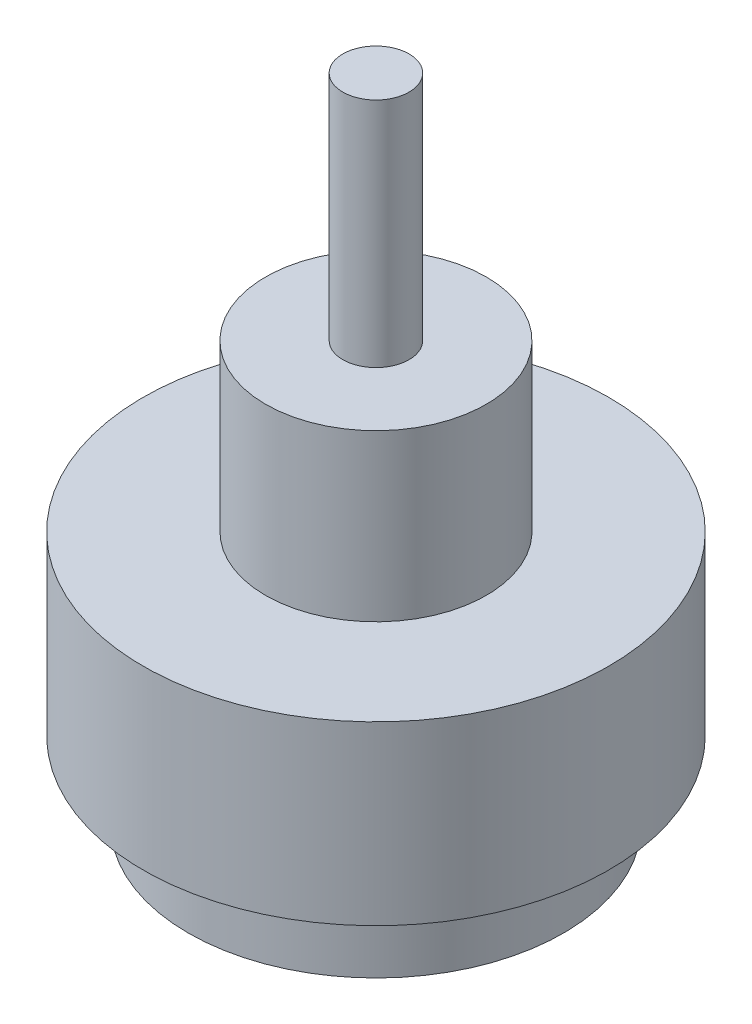
ISO-10303-21;
HEADER;
FILE_DESCRIPTION(('STEP AP214'),'2;1');
FILE_NAME('part.step','',(''),(''),'','','');
FILE_SCHEMA(('AUTOMOTIVE_DESIGN { 1 0 10303 214 1 1 1 1 }'));
ENDSEC;
DATA;
#1=APPLICATION_CONTEXT('core data for automotive mechanical design processes');
#2=APPLICATION_PROTOCOL_DEFINITION('international standard','automotive_design',2000,#1);
#3=PRODUCT_CONTEXT('',#1,'mechanical');
#4=PRODUCT('Part','Part','',(#3));
#5=PRODUCT_RELATED_PRODUCT_CATEGORY('part','',(#4));
#6=PRODUCT_DEFINITION_FORMATION('','',#4);
#7=PRODUCT_DEFINITION_CONTEXT('part definition',#1,'design');
#8=PRODUCT_DEFINITION('design','',#6,#7);
#9=PRODUCT_DEFINITION_SHAPE('','',#8);
#10=(LENGTH_UNIT() NAMED_UNIT(*) SI_UNIT(.MILLI.,.METRE.));
#11=(NAMED_UNIT(*) PLANE_ANGLE_UNIT() SI_UNIT($,.RADIAN.));
#12=(NAMED_UNIT(*) SI_UNIT($,.STERADIAN.) SOLID_ANGLE_UNIT());
#13=UNCERTAINTY_MEASURE_WITH_UNIT(LENGTH_MEASURE(1.E-05),#10,'distance_accuracy_value','');
#14=(GEOMETRIC_REPRESENTATION_CONTEXT(3) GLOBAL_UNCERTAINTY_ASSIGNED_CONTEXT((#13)) GLOBAL_UNIT_ASSIGNED_CONTEXT((#10,
#11,#12)) REPRESENTATION_CONTEXT('',''));
#15=CARTESIAN_POINT('',(0.,0.,0.));
#16=DIRECTION('',(0.,0.,1.));
#17=DIRECTION('',(1.,0.,0.));
#18=AXIS2_PLACEMENT_3D('',#15,#16,#17);
#19=CARTESIAN_POINT('',(-23.0459930518575,-14.,-11.8542930767102));
#20=DIRECTION('',(0.88925534465904,0.,0.457411119230099));
#21=DIRECTION('',(0.457411119230099,0.,-0.88925534465904));
#22=AXIS2_PLACEMENT_3D('',#19,#20,#21);
#23=PLANE('',#22);
#24=DIRECTION('',(0.457411119230099,0.,-0.88925534465904));
#25=VECTOR('',#24,1.);
#26=CARTESIAN_POINT('',(-23.0459930518575,-8.,-11.8542930767102));
#27=LINE('',#26,#25);
#28=CARTESIAN_POINT('',(-23.9120463361051,-8.,-10.1705943658592));
#29=VERTEX_POINT('',#28);
#30=CARTESIAN_POINT('',(-19.3379351438041,-8.,-19.0631478124496));
#31=VERTEX_POINT('',#30);
#32=EDGE_CURVE('E174',#29,#31,#27,.T.);
#33=ORIENTED_EDGE('',*,*,#32,.T.);
#34=DIRECTION('',(0.,1.,0.));
#35=VECTOR('',#34,1.);
#36=CARTESIAN_POINT('',(-19.3379351438041,-14.,-19.0631478124496));
#37=LINE('',#36,#35);
#38=CARTESIAN_POINT('',(-19.3379351438041,-14.,-19.0631478124496));
#39=VERTEX_POINT('',#38);
#40=EDGE_CURVE('E13',#39,#31,#37,.T.);
#41=ORIENTED_EDGE('',*,*,#40,.F.);
#42=DIRECTION('',(0.457411119230099,0.,-0.88925534465904));
#43=VECTOR('',#42,1.);
#44=CARTESIAN_POINT('',(-23.0459930518575,-14.,-11.8542930767102));
#45=LINE('',#44,#43);
#46=CARTESIAN_POINT('',(-23.9120463361051,-14.,-10.1705943658592));
#47=VERTEX_POINT('',#46);
#48=EDGE_CURVE('E153',#47,#39,#45,.T.);
#49=ORIENTED_EDGE('',*,*,#48,.F.);
#50=DIRECTION('',(0.,1.,0.));
#51=VECTOR('',#50,1.);
#52=CARTESIAN_POINT('',(-23.9120463361051,-14.,-10.1705943658592));
#53=LINE('',#52,#51);
#54=EDGE_CURVE('E172',#47,#29,#53,.T.);
#55=ORIENTED_EDGE('',*,*,#54,.T.);
#56=EDGE_LOOP('',(#33,#41,#49,#55));
#57=FACE_BOUND('',#56,.T.);
#58=ADVANCED_FACE('F115',(#57),#23,.F.);
#59=CARTESIAN_POINT('',(3.70805790805341,-14.,-7.20885473573924));
#60=DIRECTION('',(0.457411119230102,0.,-0.889255344659039));
#61=DIRECTION('',(-0.889255344659039,0.,-0.457411119230102));
#62=AXIS2_PLACEMENT_3D('',#59,#60,#61);
#63=PLANE('',#62);
#64=DIRECTION('',(-0.889255344659039,0.,-0.457411119230102));
#65=VECTOR('',#64,1.);
#66=CARTESIAN_POINT('',(3.70805790805341,-8.,-7.20885473573924));
#67=LINE('',#66,#65);
#68=CARTESIAN_POINT('',(-13.6151456474489,-8.,-16.1194853825658));
#69=VERTEX_POINT('',#68);
#70=EDGE_CURVE('E165',#69,#31,#67,.T.);
#71=ORIENTED_EDGE('',*,*,#70,.F.);
#72=DIRECTION('',(0.,1.,0.));
#73=VECTOR('',#72,1.);
#74=CARTESIAN_POINT('',(-13.6151456474489,-14.,-16.1194853825658));
#75=LINE('',#74,#73);
#76=CARTESIAN_POINT('',(-13.6151456474489,-14.,-16.1194853825658));
#77=VERTEX_POINT('',#76);
#78=EDGE_CURVE('E119',#77,#69,#75,.T.);
#79=ORIENTED_EDGE('',*,*,#78,.F.);
#80=DIRECTION('',(-0.889255344659039,0.,-0.457411119230102));
#81=VECTOR('',#80,1.);
#82=CARTESIAN_POINT('',(3.70805790805341,-14.,-7.20885473573924));
#83=LINE('',#82,#81);
#84=EDGE_CURVE('E162',#77,#39,#83,.T.);
#85=ORIENTED_EDGE('',*,*,#84,.T.);
#86=ORIENTED_EDGE('',*,*,#40,.T.);
#87=EDGE_LOOP('',(#71,#79,#85,#86));
#88=FACE_BOUND('',#87,.T.);
#89=ADVANCED_FACE('F163',(#88),#63,.T.);
#90=CARTESIAN_POINT('',(0.,-14.,0.));
#91=DIRECTION('',(0.,1.,0.));
#92=DIRECTION('',(0.,0.,1.));
#93=AXIS2_PLACEMENT_3D('',#90,#91,#92);
#94=CYLINDRICAL_SURFACE('',#93,21.1);
#95=CARTESIAN_POINT('',(0.,-8.,0.));
#96=DIRECTION('',(0.,1.,0.));
#97=DIRECTION('',(0.,0.,1.));
#98=AXIS2_PLACEMENT_3D('',#95,#96,#97);
#99=CIRCLE('',#98,21.1);
#100=CARTESIAN_POINT('',(-19.5536461382627,-8.,-7.92874029714717));
#101=VERTEX_POINT('',#100);
#102=EDGE_CURVE('E141',#69,#101,#99,.T.);
#103=ORIENTED_EDGE('',*,*,#102,.T.);
#104=DIRECTION('',(0.,1.,0.));
#105=VECTOR('',#104,1.);
#106=CARTESIAN_POINT('',(-19.5536461382627,-14.,-7.92874029714717));
#107=LINE('',#106,#105);
#108=CARTESIAN_POINT('',(-19.5536461382627,-14.,-7.92874029714717));
#109=VERTEX_POINT('',#108);
#110=EDGE_CURVE('E164',#109,#101,#107,.T.);
#111=ORIENTED_EDGE('',*,*,#110,.F.);
#112=CARTESIAN_POINT('',(0.,-14.,0.));
#113=DIRECTION('',(0.,1.,0.));
#114=DIRECTION('',(0.,0.,1.));
#115=AXIS2_PLACEMENT_3D('',#112,#113,#114);
#116=CIRCLE('',#115,21.1);
#117=EDGE_CURVE('E168',#77,#109,#116,.T.);
#118=ORIENTED_EDGE('',*,*,#117,.F.);
#119=ORIENTED_EDGE('',*,*,#78,.T.);
#120=EDGE_LOOP('',(#103,#111,#118,#119));
#121=FACE_BOUND('',#120,.T.);
#122=ADVANCED_FACE('F170',(#121),#94,.F.);
#123=CARTESIAN_POINT('',(-0.866053284247623,-14.,1.68369871085116));
#124=DIRECTION('',(0.457411119230104,0.,-0.889255344659037));
#125=DIRECTION('',(-0.889255344659037,0.,-0.457411119230104));
#126=AXIS2_PLACEMENT_3D('',#123,#124,#125);
#127=PLANE('',#126);
#128=DIRECTION('',(-0.889255344659037,0.,-0.457411119230104));
#129=VECTOR('',#128,1.);
#130=CARTESIAN_POINT('',(-0.866053284247623,-8.,1.68369871085116));
#131=LINE('',#130,#129);
#132=EDGE_CURVE('E146',#101,#29,#131,.T.);
#133=ORIENTED_EDGE('',*,*,#132,.T.);
#134=ORIENTED_EDGE('',*,*,#54,.F.);
#135=DIRECTION('',(-0.889255344659037,0.,-0.457411119230104));
#136=VECTOR('',#135,1.);
#137=CARTESIAN_POINT('',(-0.866053284247623,-14.,1.68369871085116));
#138=LINE('',#137,#136);
#139=EDGE_CURVE('E129',#109,#47,#138,.T.);
#140=ORIENTED_EDGE('',*,*,#139,.F.);
#141=ORIENTED_EDGE('',*,*,#110,.T.);
#142=EDGE_LOOP('',(#133,#134,#140,#141));
#143=FACE_BOUND('',#142,.T.);
#144=ADVANCED_FACE('F185',(#143),#127,.F.);
#145=CARTESIAN_POINT('',(0.,-14.,0.));
#146=DIRECTION('',(0.,1.,0.));
#147=DIRECTION('',(0.,0.,1.));
#148=AXIS2_PLACEMENT_3D('',#145,#146,#147);
#149=PLANE('',#148);
#150=ORIENTED_EDGE('',*,*,#48,.T.);
#151=ORIENTED_EDGE('',*,*,#84,.F.);
#152=ORIENTED_EDGE('',*,*,#117,.T.);
#153=ORIENTED_EDGE('',*,*,#139,.T.);
#154=EDGE_LOOP('',(#150,#151,#152,#153));
#155=FACE_BOUND('',#154,.T.);
#156=ADVANCED_FACE('F169',(#155),#149,.F.);
#157=CARTESIAN_POINT('',(0.,-8.,0.));
#158=DIRECTION('',(0.,1.,0.));
#159=DIRECTION('',(0.,0.,1.));
#160=AXIS2_PLACEMENT_3D('',#157,#158,#159);
#161=PLANE('',#160);
#162=ORIENTED_EDGE('',*,*,#32,.F.);
#163=ORIENTED_EDGE('',*,*,#132,.F.);
#164=ORIENTED_EDGE('',*,*,#102,.F.);
#165=ORIENTED_EDGE('',*,*,#70,.T.);
#166=EDGE_LOOP('',(#162,#163,#164,#165));
#167=FACE_BOUND('',#166,.T.);
#168=ADVANCED_FACE('F184',(#167),#161,.T.);
#169=CLOSED_SHELL('',(#58,#89,#122,#144,#156,#168));
#170=MANIFOLD_SOLID_BREP('B2',#169);
#171=CARTESIAN_POINT('',(-19.5536461382627,8.,-7.92874029714716));
#172=CARTESIAN_POINT('',(-16.8542982045805,8.,-14.2786457118331));
#173=CARTESIAN_POINT('',(-11.3167364195457,8.,-17.8084664362355));
#174=B_SPLINE_CURVE_WITH_KNOTS('',2,(#171,#172,#173),.UNSPECIFIED.,.F.,.F.,(3,3),(0.,1.),.UNSPECIFIED.);
#175=DIRECTION('',(0.,-1.,0.));
#176=VECTOR('',#175,1.);
#177=SURFACE_OF_LINEAR_EXTRUSION('',#174,#176);
#178=CARTESIAN_POINT('',(-19.5536461382627,-8.,-7.92874029714716));
#179=CARTESIAN_POINT('',(-16.8542982045805,-8.,-14.2786457118331));
#180=CARTESIAN_POINT('',(-11.3167364195457,-8.,-17.8084664362355));
#181=B_SPLINE_CURVE_WITH_KNOTS('',2,(#178,#179,#180),.UNSPECIFIED.,.F.,.F.,(3,3),(0.,1.),.UNSPECIFIED.);
#182=CARTESIAN_POINT('',(-19.5536461382627,-8.,-7.92874029714717));
#183=VERTEX_POINT('',#182);
#184=CARTESIAN_POINT('',(-13.6151456474489,-8.,-16.1194853825658));
#185=VERTEX_POINT('',#184);
#186=EDGE_CURVE('E307',#183,#185,#181,.T.);
#187=ORIENTED_EDGE('',*,*,#186,.F.);
#188=DIRECTION('',(0.,-1.,0.));
#189=VECTOR('',#188,1.);
#190=CARTESIAN_POINT('',(-19.5536461382627,8.,-7.92874029714717));
#191=LINE('',#190,#189);
#192=CARTESIAN_POINT('',(-19.5536461382627,8.,-7.92874029714717));
#193=VERTEX_POINT('',#192);
#194=EDGE_CURVE('E239',#193,#183,#191,.T.);
#195=ORIENTED_EDGE('',*,*,#194,.F.);
#196=CARTESIAN_POINT('',(-11.3167364195457,8.,-17.8084664362355));
#197=VERTEX_POINT('',#196);
#198=EDGE_CURVE('E374',#193,#197,#174,.T.);
#199=ORIENTED_EDGE('',*,*,#198,.T.);
#200=DIRECTION('',(0.,-1.,0.));
#201=VECTOR('',#200,1.);
#202=CARTESIAN_POINT('',(-11.3167364195457,8.,-17.8084664362355));
#203=LINE('',#202,#201);
#204=CARTESIAN_POINT('',(-11.3167364195457,-8.,-17.8084664362355));
#205=VERTEX_POINT('',#204);
#206=EDGE_CURVE('E387',#197,#205,#203,.T.);
#207=ORIENTED_EDGE('',*,*,#206,.T.);
#208=EDGE_CURVE('E271',#185,#205,#181,.T.);
#209=ORIENTED_EDGE('',*,*,#208,.F.);
#210=EDGE_LOOP('',(#187,#195,#199,#207,#209));
#211=FACE_BOUND('',#210,.T.);
#212=ADVANCED_FACE('F236',(#211),#177,.T.);
#213=CARTESIAN_POINT('',(0.,8.,0.));
#214=DIRECTION('',(0.,-1.,0.));
#215=DIRECTION('',(0.,0.,-1.));
#216=AXIS2_PLACEMENT_3D('',#213,#214,#215);
#217=CYLINDRICAL_SURFACE('',#216,21.1);
#218=CARTESIAN_POINT('',(0.,-8.,0.));
#219=DIRECTION('',(0.,1.,0.));
#220=DIRECTION('',(0.,0.,1.));
#221=AXIS2_PLACEMENT_3D('',#218,#219,#220);
#222=CIRCLE('',#221,21.1);
#223=EDGE_CURVE('E382',#183,#205,#222,.T.);
#224=ORIENTED_EDGE('',*,*,#223,.T.);
#225=ORIENTED_EDGE('',*,*,#206,.F.);
#226=CARTESIAN_POINT('',(0.,8.,0.));
#227=DIRECTION('',(0.,1.,0.));
#228=DIRECTION('',(0.,0.,1.));
#229=AXIS2_PLACEMENT_3D('',#226,#227,#228);
#230=CIRCLE('',#229,21.1);
#231=EDGE_CURVE('E261',#193,#197,#230,.T.);
#232=ORIENTED_EDGE('',*,*,#231,.F.);
#233=ORIENTED_EDGE('',*,*,#194,.T.);
#234=EDGE_LOOP('',(#224,#225,#232,#233));
#235=FACE_BOUND('',#234,.T.);
#236=ADVANCED_FACE('F397',(#235),#217,.T.);
#237=CARTESIAN_POINT('',(0.,8.,0.));
#238=DIRECTION('',(0.,1.,0.));
#239=DIRECTION('',(0.,0.,1.));
#240=AXIS2_PLACEMENT_3D('',#237,#238,#239);
#241=PLANE('',#240);
#242=CARTESIAN_POINT('',(0.,8.,0.));
#243=DIRECTION('',(0.,1.,0.));
#244=DIRECTION('',(0.,0.,1.));
#245=AXIS2_PLACEMENT_3D('',#242,#243,#244);
#246=CIRCLE('',#245,10.);
#247=CARTESIAN_POINT('',(0.,8.,10.));
#248=VERTEX_POINT('',#247);
#249=EDGE_CURVE('E371',#248,#248,#246,.T.);
#250=ORIENTED_EDGE('',*,*,#249,.F.);
#251=EDGE_LOOP('',(#250));
#252=FACE_BOUND('',#251,.T.);
#253=ORIENTED_EDGE('',*,*,#198,.F.);
#254=ORIENTED_EDGE('',*,*,#231,.T.);
#255=EDGE_LOOP('',(#253,#254));
#256=FACE_BOUND('',#255,.T.);
#257=ADVANCED_FACE('F403',(#252,#256),#241,.T.);
#258=CARTESIAN_POINT('',(0.,-8.,0.));
#259=DIRECTION('',(0.,1.,0.));
#260=DIRECTION('',(0.,0.,1.));
#261=AXIS2_PLACEMENT_3D('',#258,#259,#260);
#262=PLANE('',#261);
#263=CARTESIAN_POINT('',(0.,-8.,0.));
#264=DIRECTION('',(0.,1.,0.));
#265=DIRECTION('',(0.,0.,1.));
#266=AXIS2_PLACEMENT_3D('',#263,#264,#265);
#267=CIRCLE('',#266,17.);
#268=CARTESIAN_POINT('',(-15.8893403181968,-8.,-6.04391133724885));
#269=VERTEX_POINT('',#268);
#270=CARTESIAN_POINT('',(-9.5797714125075,-8.,-14.0437879393027));
#271=VERTEX_POINT('',#270);
#272=EDGE_CURVE('E358',#269,#271,#267,.T.);
#273=ORIENTED_EDGE('',*,*,#272,.T.);
#274=DIRECTION('',(-0.889255344659039,0.,-0.457411119230102));
#275=VECTOR('',#274,1.);
#276=CARTESIAN_POINT('',(3.70805790805341,-8.,-7.20885473573924));
#277=LINE('',#276,#275);
#278=EDGE_CURVE('E326',#271,#185,#277,.T.);
#279=ORIENTED_EDGE('',*,*,#278,.T.);
#280=ORIENTED_EDGE('',*,*,#208,.T.);
#281=ORIENTED_EDGE('',*,*,#223,.F.);
#282=DIRECTION('',(-0.889255344659037,0.,-0.457411119230104));
#283=VECTOR('',#282,1.);
#284=CARTESIAN_POINT('',(-0.866053284247623,-8.,1.68369871085116));
#285=LINE('',#284,#283);
#286=EDGE_CURVE('E300',#269,#183,#285,.T.);
#287=ORIENTED_EDGE('',*,*,#286,.F.);
#288=EDGE_LOOP('',(#273,#279,#280,#281,#287));
#289=FACE_BOUND('',#288,.T.);
#290=ADVANCED_FACE('F399',(#289),#262,.F.);
#291=CARTESIAN_POINT('',(0.,23.,0.));
#292=DIRECTION('',(0.,-1.,0.));
#293=DIRECTION('',(0.,0.,-1.));
#294=AXIS2_PLACEMENT_3D('',#291,#292,#293);
#295=CYLINDRICAL_SURFACE('',#294,10.);
#296=CARTESIAN_POINT('',(0.,23.,0.));
#297=DIRECTION('',(0.,1.,0.));
#298=DIRECTION('',(0.,0.,1.));
#299=AXIS2_PLACEMENT_3D('',#296,#297,#298);
#300=CIRCLE('',#299,10.);
#301=CARTESIAN_POINT('',(0.,23.,10.));
#302=VERTEX_POINT('',#301);
#303=EDGE_CURVE('E368',#302,#302,#300,.T.);
#304=ORIENTED_EDGE('',*,*,#303,.F.);
#305=EDGE_LOOP('',(#304));
#306=FACE_BOUND('',#305,.T.);
#307=ORIENTED_EDGE('',*,*,#249,.T.);
#308=EDGE_LOOP('',(#307));
#309=FACE_BOUND('',#308,.T.);
#310=ADVANCED_FACE('F412',(#306,#309),#295,.T.);
#311=CARTESIAN_POINT('',(0.,23.,0.));
#312=DIRECTION('',(0.,1.,0.));
#313=DIRECTION('',(0.,0.,1.));
#314=AXIS2_PLACEMENT_3D('',#311,#312,#313);
#315=PLANE('',#314);
#316=CARTESIAN_POINT('',(0.,23.,0.));
#317=DIRECTION('',(0.,1.,0.));
#318=DIRECTION('',(0.,0.,1.));
#319=AXIS2_PLACEMENT_3D('',#316,#317,#318);
#320=CIRCLE('',#319,3.);
#321=CARTESIAN_POINT('',(0.,23.,-3.));
#322=VERTEX_POINT('',#321);
#323=EDGE_CURVE('E360',#322,#322,#320,.T.);
#324=ORIENTED_EDGE('',*,*,#323,.F.);
#325=EDGE_LOOP('',(#324));
#326=FACE_BOUND('',#325,.T.);
#327=ORIENTED_EDGE('',*,*,#303,.T.);
#328=EDGE_LOOP('',(#327));
#329=FACE_BOUND('',#328,.T.);
#330=ADVANCED_FACE('F418',(#326,#329),#315,.T.);
#331=CARTESIAN_POINT('',(0.,44.,0.));
#332=DIRECTION('',(0.,-1.,0.));
#333=DIRECTION('',(0.,0.,-1.));
#334=AXIS2_PLACEMENT_3D('',#331,#332,#333);
#335=CYLINDRICAL_SURFACE('',#334,3.);
#336=CARTESIAN_POINT('',(0.,44.,0.));
#337=DIRECTION('',(0.,1.,0.));
#338=DIRECTION('',(0.,0.,1.));
#339=AXIS2_PLACEMENT_3D('',#336,#337,#338);
#340=CIRCLE('',#339,3.);
#341=CARTESIAN_POINT('',(0.,44.,-3.));
#342=VERTEX_POINT('',#341);
#343=EDGE_CURVE('E361',#342,#342,#340,.T.);
#344=CARTESIAN_POINT('',(0.,44.,-3.));
#345=CARTESIAN_POINT('',(0.,43.78125,-3.));
#346=CARTESIAN_POINT('',(0.,43.5625,-3.));
#347=CARTESIAN_POINT('',(0.,43.125,-3.));
#348=CARTESIAN_POINT('',(0.,42.90625,-3.));
#349=CARTESIAN_POINT('',(0.,42.46875,-3.));
#350=CARTESIAN_POINT('',(0.,42.25,-3.));
#351=CARTESIAN_POINT('',(0.,41.8125,-3.));
#352=CARTESIAN_POINT('',(0.,41.59375,-3.));
#353=CARTESIAN_POINT('',(0.,41.15625,-3.));
#354=CARTESIAN_POINT('',(0.,40.9375,-3.));
#355=CARTESIAN_POINT('',(0.,40.5,-3.));
#356=CARTESIAN_POINT('',(0.,40.28125,-3.));
#357=CARTESIAN_POINT('',(0.,39.84375,-3.));
#358=CARTESIAN_POINT('',(0.,39.625,-3.));
#359=CARTESIAN_POINT('',(0.,39.1875,-3.));
#360=CARTESIAN_POINT('',(0.,38.96875,-3.));
#361=CARTESIAN_POINT('',(0.,38.53125,-3.));
#362=CARTESIAN_POINT('',(0.,38.3125,-3.));
#363=CARTESIAN_POINT('',(0.,37.875,-3.));
#364=CARTESIAN_POINT('',(0.,37.65625,-3.));
#365=CARTESIAN_POINT('',(0.,37.21875,-3.));
#366=CARTESIAN_POINT('',(0.,37.,-3.));
#367=CARTESIAN_POINT('',(0.,36.5625,-3.));
#368=CARTESIAN_POINT('',(0.,36.34375,-3.));
#369=CARTESIAN_POINT('',(0.,35.90625,-3.));
#370=CARTESIAN_POINT('',(0.,35.6875,-3.));
#371=CARTESIAN_POINT('',(0.,35.25,-3.));
#372=CARTESIAN_POINT('',(0.,35.03125,-3.));
#373=CARTESIAN_POINT('',(0.,34.59375,-3.));
#374=CARTESIAN_POINT('',(0.,34.375,-3.));
#375=CARTESIAN_POINT('',(0.,33.9375,-3.));
#376=CARTESIAN_POINT('',(0.,33.71875,-3.));
#377=CARTESIAN_POINT('',(0.,33.28125,-3.));
#378=CARTESIAN_POINT('',(0.,33.0625,-3.));
#379=CARTESIAN_POINT('',(0.,32.625,-3.));
#380=CARTESIAN_POINT('',(0.,32.40625,-3.));
#381=CARTESIAN_POINT('',(0.,31.96875,-3.));
#382=CARTESIAN_POINT('',(0.,31.75,-3.));
#383=CARTESIAN_POINT('',(0.,31.3125,-3.));
#384=CARTESIAN_POINT('',(0.,31.09375,-3.));
#385=CARTESIAN_POINT('',(0.,30.65625,-3.));
#386=CARTESIAN_POINT('',(0.,30.4375,-3.));
#387=CARTESIAN_POINT('',(0.,30.,-3.));
#388=CARTESIAN_POINT('',(0.,29.78125,-3.));
#389=CARTESIAN_POINT('',(0.,29.34375,-3.));
#390=CARTESIAN_POINT('',(0.,29.125,-3.));
#391=CARTESIAN_POINT('',(0.,28.6875,-3.));
#392=CARTESIAN_POINT('',(0.,28.46875,-3.));
#393=CARTESIAN_POINT('',(0.,28.03125,-3.));
#394=CARTESIAN_POINT('',(0.,27.8125,-3.));
#395=CARTESIAN_POINT('',(0.,27.375,-3.));
#396=CARTESIAN_POINT('',(0.,27.15625,-3.));
#397=CARTESIAN_POINT('',(0.,26.71875,-3.));
#398=CARTESIAN_POINT('',(0.,26.5,-3.));
#399=CARTESIAN_POINT('',(0.,26.0625,-3.));
#400=CARTESIAN_POINT('',(0.,25.84375,-3.));
#401=CARTESIAN_POINT('',(0.,25.40625,-3.));
#402=CARTESIAN_POINT('',(0.,25.1875,-3.));
#403=CARTESIAN_POINT('',(0.,24.75,-3.));
#404=CARTESIAN_POINT('',(0.,24.53125,-3.));
#405=CARTESIAN_POINT('',(0.,24.09375,-3.));
#406=CARTESIAN_POINT('',(0.,23.875,-3.));
#407=CARTESIAN_POINT('',(0.,23.4375,-3.));
#408=CARTESIAN_POINT('',(0.,23.21875,-3.));
#409=CARTESIAN_POINT('',(0.,23.,-3.));
#410=B_SPLINE_CURVE_WITH_KNOTS('',3,(#344,#345,#346,#347,#348,#349,#350,#351,#352,#353,#354,
#355,#356,#357,#358,#359,#360,#361,#362,#363,#364,#365,#366,#367,#368,#369,#370,#371,#372,#373,
#374,#375,#376,#377,#378,#379,#380,#381,#382,#383,#384,#385,#386,#387,#388,#389,#390,#391,#392,
#393,#394,#395,#396,#397,#398,#399,#400,#401,#402,#403,#404,#405,#406,#407,#408,#409),
.UNSPECIFIED.,.F.,.F.,(4,2,2,2,2,2,2,2,2,2,2,2,2,2,2,2,2,2,2,2,2,2,2,2,2,2,2,2,2,2,2,2,4),(0.,
0.656250000000004,1.3125,1.96875000000001,2.625,3.28125000000001,3.9375,4.59375,5.25,5.90625,
6.56250000000001,7.21875,7.875,8.53125,9.1875,9.84375,10.5,11.15625,11.8125,12.46875,13.125,
13.78125,14.4375,15.09375,15.75,16.40625,17.0625,17.71875,18.375,19.03125,19.6875,20.34375,21.),.UNSPECIFIED.);
#411=EDGE_CURVE('BSEAM421',#342,#322,#410,.T.);
#412=ORIENTED_EDGE('',*,*,#343,.F.);
#413=ORIENTED_EDGE('',*,*,#323,.T.);
#414=ORIENTED_EDGE('',*,*,#411,.T.);
#415=ORIENTED_EDGE('',*,*,#411,.F.);
#416=EDGE_LOOP('',(#412,#414,#413,#415));
#417=FACE_BOUND('',#416,.T.);
#418=ADVANCED_FACE('F421',(#417),#335,.T.);
#419=CARTESIAN_POINT('',(0.,44.,0.));
#420=DIRECTION('',(0.,1.,0.));
#421=DIRECTION('',(0.,0.,1.));
#422=AXIS2_PLACEMENT_3D('',#419,#420,#421);
#423=PLANE('',#422);
#424=ORIENTED_EDGE('',*,*,#343,.T.);
#425=EDGE_LOOP('',(#424));
#426=FACE_BOUND('',#425,.T.);
#427=ADVANCED_FACE('F430',(#426),#423,.T.);
#428=CARTESIAN_POINT('',(0.,-15.,0.));
#429=DIRECTION('',(0.,1.,0.));
#430=DIRECTION('',(0.,0.,1.));
#431=AXIS2_PLACEMENT_3D('',#428,#429,#430);
#432=CYLINDRICAL_SURFACE('',#431,17.);
#433=DIRECTION('',(0.,1.,0.));
#434=VECTOR('',#433,1.);
#435=CARTESIAN_POINT('',(-9.5797714125075,-14.,-14.0437879393027));
#436=LINE('',#435,#434);
#437=CARTESIAN_POINT('',(-9.5797714125075,-14.,-14.0437879393027));
#438=VERTEX_POINT('',#437);
#439=EDGE_CURVE('E315',#438,#271,#436,.T.);
#440=ORIENTED_EDGE('',*,*,#439,.T.);
#441=ORIENTED_EDGE('',*,*,#272,.F.);
#442=DIRECTION('',(0.,1.,0.));
#443=VECTOR('',#442,1.);
#444=CARTESIAN_POINT('',(-15.8893403181968,-14.,-6.04391133724885));
#445=LINE('',#444,#443);
#446=CARTESIAN_POINT('',(-15.8893403181968,-14.,-6.04391133724885));
#447=VERTEX_POINT('',#446);
#448=EDGE_CURVE('E329',#447,#269,#445,.T.);
#449=ORIENTED_EDGE('',*,*,#448,.F.);
#450=CARTESIAN_POINT('',(0.,-14.,0.));
#451=DIRECTION('',(0.,1.,0.));
#452=DIRECTION('',(0.,0.,1.));
#453=AXIS2_PLACEMENT_3D('',#450,#451,#452);
#454=CIRCLE('',#453,17.);
#455=EDGE_CURVE('E320',#438,#447,#454,.T.);
#456=ORIENTED_EDGE('',*,*,#455,.F.);
#457=EDGE_LOOP('',(#440,#441,#449,#456));
#458=FACE_BOUND('',#457,.T.);
#459=CARTESIAN_POINT('',(0.,-15.,0.));
#460=DIRECTION('',(0.,1.,0.));
#461=DIRECTION('',(0.,0.,1.));
#462=AXIS2_PLACEMENT_3D('',#459,#460,#461);
#463=CIRCLE('',#462,17.);
#464=CARTESIAN_POINT('',(0.,-15.,17.));
#465=VERTEX_POINT('',#464);
#466=EDGE_CURVE('E359',#465,#465,#463,.T.);
#467=ORIENTED_EDGE('',*,*,#466,.T.);
#468=EDGE_LOOP('',(#467));
#469=FACE_BOUND('',#468,.T.);
#470=ADVANCED_FACE('F431',(#458,#469),#432,.T.);
#471=CARTESIAN_POINT('',(0.,-15.,0.));
#472=DIRECTION('',(0.,1.,0.));
#473=DIRECTION('',(0.,0.,1.));
#474=AXIS2_PLACEMENT_3D('',#471,#472,#473);
#475=PLANE('',#474);
#476=CARTESIAN_POINT('',(9.5,-15.,0.));
#477=DIRECTION('',(0.,1.,0.));
#478=DIRECTION('',(0.,0.,1.));
#479=AXIS2_PLACEMENT_3D('',#476,#477,#478);
#480=CIRCLE('',#479,1.5);
#481=CARTESIAN_POINT('',(9.5,-15.,1.5));
#482=VERTEX_POINT('',#481);
#483=EDGE_CURVE('E311',#482,#482,#480,.T.);
#484=ORIENTED_EDGE('',*,*,#483,.T.);
#485=EDGE_LOOP('',(#484));
#486=FACE_BOUND('',#485,.T.);
#487=CARTESIAN_POINT('',(-9.5,-15.,0.));
#488=DIRECTION('',(0.,1.,0.));
#489=DIRECTION('',(0.,0.,1.));
#490=AXIS2_PLACEMENT_3D('',#487,#488,#489);
#491=CIRCLE('',#490,1.5);
#492=CARTESIAN_POINT('',(-9.5,-15.,1.5));
#493=VERTEX_POINT('',#492);
#494=EDGE_CURVE('E333',#493,#493,#491,.T.);
#495=ORIENTED_EDGE('',*,*,#494,.T.);
#496=EDGE_LOOP('',(#495));
#497=FACE_BOUND('',#496,.T.);
#498=CARTESIAN_POINT('',(0.,-15.,12.5));
#499=DIRECTION('',(0.,1.,0.));
#500=DIRECTION('',(0.,0.,1.));
#501=AXIS2_PLACEMENT_3D('',#498,#499,#500);
#502=CIRCLE('',#501,1.5);
#503=CARTESIAN_POINT('',(0.,-15.,14.));
#504=VERTEX_POINT('',#503);
#505=EDGE_CURVE('E336',#504,#504,#502,.T.);
#506=ORIENTED_EDGE('',*,*,#505,.T.);
#507=EDGE_LOOP('',(#506));
#508=FACE_BOUND('',#507,.T.);
#509=CARTESIAN_POINT('',(0.,-15.,-12.5));
#510=DIRECTION('',(0.,1.,0.));
#511=DIRECTION('',(0.,0.,1.));
#512=AXIS2_PLACEMENT_3D('',#509,#510,#511);
#513=CIRCLE('',#512,1.5);
#514=CARTESIAN_POINT('',(0.,-15.,-11.));
#515=VERTEX_POINT('',#514);
#516=EDGE_CURVE('E341',#515,#515,#513,.T.);
#517=ORIENTED_EDGE('',*,*,#516,.T.);
#518=EDGE_LOOP('',(#517));
#519=FACE_BOUND('',#518,.T.);
#520=CARTESIAN_POINT('',(0.,-15.,0.));
#521=DIRECTION('',(0.,1.,0.));
#522=DIRECTION('',(0.,0.,1.));
#523=AXIS2_PLACEMENT_3D('',#520,#521,#522);
#524=CIRCLE('',#523,3.);
#525=CARTESIAN_POINT('',(0.,-15.,3.));
#526=VERTEX_POINT('',#525);
#527=EDGE_CURVE('E349',#526,#526,#524,.T.);
#528=ORIENTED_EDGE('',*,*,#527,.T.);
#529=EDGE_LOOP('',(#528));
#530=FACE_BOUND('',#529,.T.);
#531=ORIENTED_EDGE('',*,*,#466,.F.);
#532=EDGE_LOOP('',(#531));
#533=FACE_BOUND('',#532,.T.);
#534=ADVANCED_FACE('F434',(#486,#497,#508,#519,#530,#533),#475,.F.);
#535=CARTESIAN_POINT('',(0.,-15.,0.));
#536=DIRECTION('',(0.,1.,0.));
#537=DIRECTION('',(0.,0.,1.));
#538=AXIS2_PLACEMENT_3D('',#535,#536,#537);
#539=CYLINDRICAL_SURFACE('',#538,3.);
#540=ORIENTED_EDGE('',*,*,#527,.F.);
#541=EDGE_LOOP('',(#540));
#542=FACE_BOUND('',#541,.T.);
#543=CARTESIAN_POINT('',(0.,-8.,0.));
#544=DIRECTION('',(0.,1.,0.));
#545=DIRECTION('',(0.,0.,1.));
#546=AXIS2_PLACEMENT_3D('',#543,#544,#545);
#547=CIRCLE('',#546,3.);
#548=CARTESIAN_POINT('',(0.,-8.,3.));
#549=VERTEX_POINT('',#548);
#550=EDGE_CURVE('E354',#549,#549,#547,.T.);
#551=ORIENTED_EDGE('',*,*,#550,.T.);
#552=EDGE_LOOP('',(#551));
#553=FACE_BOUND('',#552,.T.);
#554=ADVANCED_FACE('F437',(#542,#553),#539,.F.);
#555=CARTESIAN_POINT('',(0.,-15.,-12.5));
#556=DIRECTION('',(0.,1.,0.));
#557=DIRECTION('',(0.,0.,1.));
#558=AXIS2_PLACEMENT_3D('',#555,#556,#557);
#559=CYLINDRICAL_SURFACE('',#558,1.5);
#560=ORIENTED_EDGE('',*,*,#516,.F.);
#561=EDGE_LOOP('',(#560));
#562=FACE_BOUND('',#561,.T.);
#563=CARTESIAN_POINT('',(0.,-8.,-12.5));
#564=DIRECTION('',(0.,1.,0.));
#565=DIRECTION('',(0.,0.,1.));
#566=AXIS2_PLACEMENT_3D('',#563,#564,#565);
#567=CIRCLE('',#566,1.5);
#568=CARTESIAN_POINT('',(0.,-8.,-11.));
#569=VERTEX_POINT('',#568);
#570=EDGE_CURVE('E350',#569,#569,#567,.T.);
#571=ORIENTED_EDGE('',*,*,#570,.T.);
#572=EDGE_LOOP('',(#571));
#573=FACE_BOUND('',#572,.T.);
#574=ADVANCED_FACE('F442',(#562,#573),#559,.F.);
#575=CARTESIAN_POINT('',(0.,-15.,12.5));
#576=DIRECTION('',(0.,1.,0.));
#577=DIRECTION('',(0.,0.,1.));
#578=AXIS2_PLACEMENT_3D('',#575,#576,#577);
#579=CYLINDRICAL_SURFACE('',#578,1.5);
#580=ORIENTED_EDGE('',*,*,#505,.F.);
#581=EDGE_LOOP('',(#580));
#582=FACE_BOUND('',#581,.T.);
#583=CARTESIAN_POINT('',(0.,-8.,12.5));
#584=DIRECTION('',(0.,1.,0.));
#585=DIRECTION('',(0.,0.,1.));
#586=AXIS2_PLACEMENT_3D('',#583,#584,#585);
#587=CIRCLE('',#586,1.5);
#588=CARTESIAN_POINT('',(0.,-8.,14.));
#589=VERTEX_POINT('',#588);
#590=EDGE_CURVE('E342',#589,#589,#587,.T.);
#591=ORIENTED_EDGE('',*,*,#590,.T.);
#592=EDGE_LOOP('',(#591));
#593=FACE_BOUND('',#592,.T.);
#594=ADVANCED_FACE('F450',(#582,#593),#579,.F.);
#595=CARTESIAN_POINT('',(-9.5,-15.,0.));
#596=DIRECTION('',(0.,1.,0.));
#597=DIRECTION('',(0.,0.,1.));
#598=AXIS2_PLACEMENT_3D('',#595,#596,#597);
#599=CYLINDRICAL_SURFACE('',#598,1.5);
#600=ORIENTED_EDGE('',*,*,#494,.F.);
#601=EDGE_LOOP('',(#600));
#602=FACE_BOUND('',#601,.T.);
#603=CARTESIAN_POINT('',(-9.5,-8.,0.));
#604=DIRECTION('',(0.,1.,0.));
#605=DIRECTION('',(0.,0.,1.));
#606=AXIS2_PLACEMENT_3D('',#603,#604,#605);
#607=CIRCLE('',#606,1.5);
#608=CARTESIAN_POINT('',(-9.5,-8.,1.5));
#609=VERTEX_POINT('',#608);
#610=EDGE_CURVE('E244',#609,#609,#607,.T.);
#611=ORIENTED_EDGE('',*,*,#610,.T.);
#612=EDGE_LOOP('',(#611));
#613=FACE_BOUND('',#612,.T.);
#614=ADVANCED_FACE('F452',(#602,#613),#599,.F.);
#615=CARTESIAN_POINT('',(9.5,-15.,0.));
#616=DIRECTION('',(0.,1.,0.));
#617=DIRECTION('',(0.,0.,1.));
#618=AXIS2_PLACEMENT_3D('',#615,#616,#617);
#619=CYLINDRICAL_SURFACE('',#618,1.5);
#620=ORIENTED_EDGE('',*,*,#483,.F.);
#621=EDGE_LOOP('',(#620));
#622=FACE_BOUND('',#621,.T.);
#623=CARTESIAN_POINT('',(9.5,-8.,0.));
#624=DIRECTION('',(0.,1.,0.));
#625=DIRECTION('',(0.,0.,1.));
#626=AXIS2_PLACEMENT_3D('',#623,#624,#625);
#627=CIRCLE('',#626,1.5);
#628=CARTESIAN_POINT('',(9.5,-8.,1.5));
#629=VERTEX_POINT('',#628);
#630=EDGE_CURVE('E109',#629,#629,#627,.T.);
#631=ORIENTED_EDGE('',*,*,#630,.T.);
#632=EDGE_LOOP('',(#631));
#633=FACE_BOUND('',#632,.T.);
#634=ADVANCED_FACE('F453',(#622,#633),#619,.F.);
#635=ORIENTED_EDGE('',*,*,#550,.F.);
#636=EDGE_LOOP('',(#635));
#637=FACE_BOUND('',#636,.T.);
#638=ADVANCED_FACE('F414',(#637),#262,.F.);
#639=ORIENTED_EDGE('',*,*,#570,.F.);
#640=EDGE_LOOP('',(#639));
#641=FACE_BOUND('',#640,.T.);
#642=ADVANCED_FACE('F533',(#641),#262,.F.);
#643=ORIENTED_EDGE('',*,*,#590,.F.);
#644=EDGE_LOOP('',(#643));
#645=FACE_BOUND('',#644,.T.);
#646=ADVANCED_FACE('F547',(#645),#262,.F.);
#647=ORIENTED_EDGE('',*,*,#610,.F.);
#648=EDGE_LOOP('',(#647));
#649=FACE_BOUND('',#648,.T.);
#650=ADVANCED_FACE('F559',(#649),#262,.F.);
#651=ORIENTED_EDGE('',*,*,#630,.F.);
#652=EDGE_LOOP('',(#651));
#653=FACE_BOUND('',#652,.T.);
#654=ADVANCED_FACE('F413',(#653),#262,.F.);
#655=CARTESIAN_POINT('',(-19.5536461382627,-14.,-7.92874029714716));
#656=CARTESIAN_POINT('',(-17.4479491624563,-14.,-12.8821501416208));
#657=CARTESIAN_POINT('',(-13.6151456474489,-14.,-16.1194853825658));
#658=B_SPLINE_CURVE_WITH_KNOTS('',2,(#655,#656,#657),.UNSPECIFIED.,.F.,.F.,(3,3),(0.,1.),.UNSPECIFIED.);
#659=DIRECTION('',(0.,1.,0.));
#660=VECTOR('',#659,1.);
#661=SURFACE_OF_LINEAR_EXTRUSION('',#658,#660);
#662=ORIENTED_EDGE('',*,*,#186,.T.);
#663=DIRECTION('',(0.,1.,0.));
#664=VECTOR('',#663,1.);
#665=CARTESIAN_POINT('',(-13.6151456474489,-14.,-16.1194853825658));
#666=LINE('',#665,#664);
#667=CARTESIAN_POINT('',(-13.6151456474489,-14.,-16.1194853825658));
#668=VERTEX_POINT('',#667);
#669=EDGE_CURVE('E306',#668,#185,#666,.T.);
#670=ORIENTED_EDGE('',*,*,#669,.F.);
#671=CARTESIAN_POINT('',(-19.5536461382627,-14.,-7.92874029714717));
#672=VERTEX_POINT('',#671);
#673=EDGE_CURVE('E297',#672,#668,#658,.T.);
#674=ORIENTED_EDGE('',*,*,#673,.F.);
#675=DIRECTION('',(0.,1.,0.));
#676=VECTOR('',#675,1.);
#677=CARTESIAN_POINT('',(-19.5536461382627,-14.,-7.92874029714717));
#678=LINE('',#677,#676);
#679=EDGE_CURVE('E323',#672,#183,#678,.T.);
#680=ORIENTED_EDGE('',*,*,#679,.T.);
#681=EDGE_LOOP('',(#662,#670,#674,#680));
#682=FACE_BOUND('',#681,.T.);
#683=ADVANCED_FACE('F310',(#682),#661,.F.);
#684=CARTESIAN_POINT('',(3.70805790805341,-14.,-7.20885473573924));
#685=DIRECTION('',(0.457411119230102,0.,-0.889255344659039));
#686=DIRECTION('',(-0.889255344659039,0.,-0.457411119230102));
#687=AXIS2_PLACEMENT_3D('',#684,#685,#686);
#688=PLANE('',#687);
#689=ORIENTED_EDGE('',*,*,#278,.F.);
#690=ORIENTED_EDGE('',*,*,#439,.F.);
#691=DIRECTION('',(-0.889255344659039,0.,-0.457411119230102));
#692=VECTOR('',#691,1.);
#693=CARTESIAN_POINT('',(3.70805790805341,-14.,-7.20885473573924));
#694=LINE('',#693,#692);
#695=EDGE_CURVE('E254',#438,#668,#694,.T.);
#696=ORIENTED_EDGE('',*,*,#695,.T.);
#697=ORIENTED_EDGE('',*,*,#669,.T.);
#698=EDGE_LOOP('',(#689,#690,#696,#697));
#699=FACE_BOUND('',#698,.T.);
#700=ADVANCED_FACE('F313',(#699),#688,.T.);
#701=CARTESIAN_POINT('',(-0.866053284247623,-14.,1.68369871085116));
#702=DIRECTION('',(0.457411119230104,0.,-0.889255344659037));
#703=DIRECTION('',(-0.889255344659037,0.,-0.457411119230104));
#704=AXIS2_PLACEMENT_3D('',#701,#702,#703);
#705=PLANE('',#704);
#706=ORIENTED_EDGE('',*,*,#286,.T.);
#707=ORIENTED_EDGE('',*,*,#679,.F.);
#708=DIRECTION('',(-0.889255344659037,0.,-0.457411119230104));
#709=VECTOR('',#708,1.);
#710=CARTESIAN_POINT('',(-0.866053284247623,-14.,1.68369871085116));
#711=LINE('',#710,#709);
#712=EDGE_CURVE('E276',#447,#672,#711,.T.);
#713=ORIENTED_EDGE('',*,*,#712,.F.);
#714=ORIENTED_EDGE('',*,*,#448,.T.);
#715=EDGE_LOOP('',(#706,#707,#713,#714));
#716=FACE_BOUND('',#715,.T.);
#717=ADVANCED_FACE('F463',(#716),#705,.F.);
#718=CARTESIAN_POINT('',(-17.016172527656,-14.,-12.4531314907386));
#719=DIRECTION('',(0.,1.,0.));
#720=DIRECTION('',(0.,0.,1.));
#721=AXIS2_PLACEMENT_3D('',#718,#719,#720);
#722=PLANE('',#721);
#723=ORIENTED_EDGE('',*,*,#673,.T.);
#724=ORIENTED_EDGE('',*,*,#695,.F.);
#725=ORIENTED_EDGE('',*,*,#455,.T.);
#726=ORIENTED_EDGE('',*,*,#712,.T.);
#727=EDGE_LOOP('',(#723,#724,#725,#726));
#728=FACE_BOUND('',#727,.T.);
#729=ADVANCED_FACE('F305',(#728),#722,.F.);
#730=CLOSED_SHELL('',(#212,#236,#257,#290,#310,#330,#418,#427,#470,#534,#554,#574,#594,#614,
#634,#638,#642,#646,#650,#654,#683,#700,#717,#729));
#731=MANIFOLD_SOLID_BREP('B7',#730);
#732=ADVANCED_BREP_SHAPE_REPRESENTATION('',(#18,#170,#731),#14);
#733=SHAPE_DEFINITION_REPRESENTATION(#9,#732);
ENDSEC;
END-ISO-10303-21;
